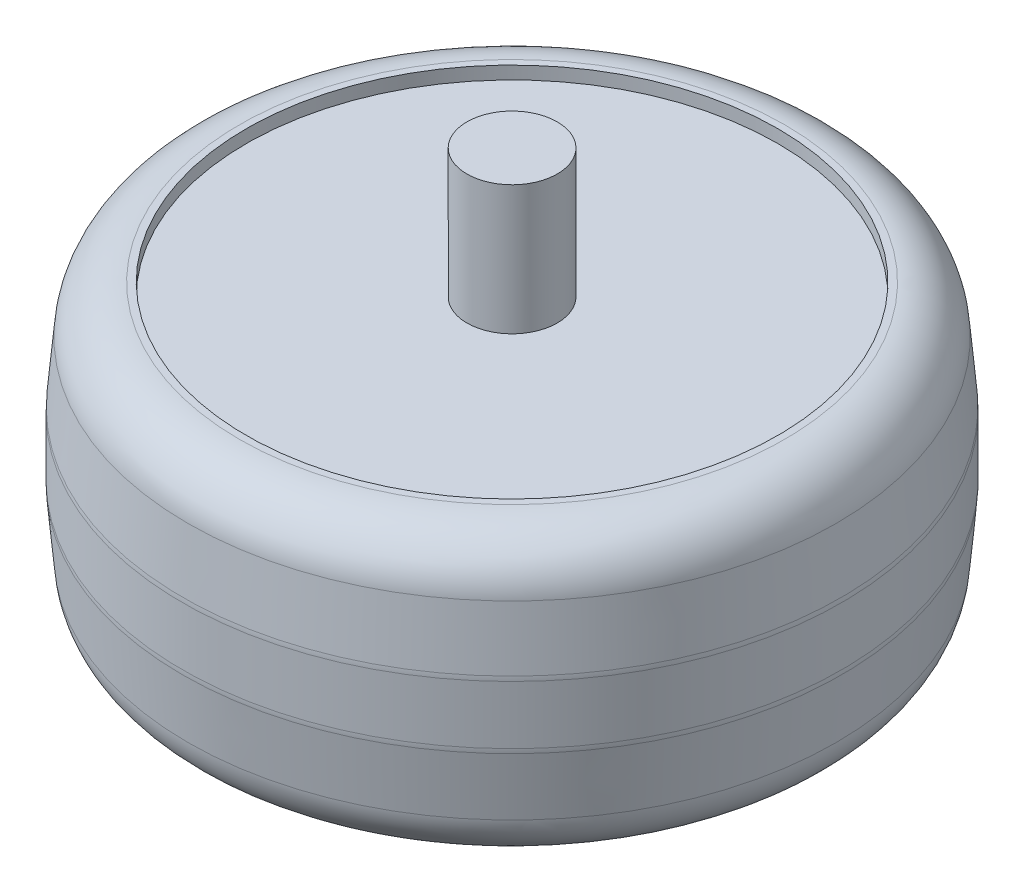
ISO-10303-21;
HEADER;
FILE_DESCRIPTION(('STEP AP214'),'2;1');
FILE_NAME('part.step','',(''),(''),'','','');
FILE_SCHEMA(('AUTOMOTIVE_DESIGN { 1 0 10303 214 1 1 1 1 }'));
ENDSEC;
DATA;
#1=APPLICATION_CONTEXT('core data for automotive mechanical design processes');
#2=APPLICATION_PROTOCOL_DEFINITION('international standard','automotive_design',2000,#1);
#3=PRODUCT_CONTEXT('',#1,'mechanical');
#4=PRODUCT('Part','Part','',(#3));
#5=PRODUCT_RELATED_PRODUCT_CATEGORY('part','',(#4));
#6=PRODUCT_DEFINITION_FORMATION('','',#4);
#7=PRODUCT_DEFINITION_CONTEXT('part definition',#1,'design');
#8=PRODUCT_DEFINITION('design','',#6,#7);
#9=PRODUCT_DEFINITION_SHAPE('','',#8);
#10=(LENGTH_UNIT() NAMED_UNIT(*) SI_UNIT(.MILLI.,.METRE.));
#11=(NAMED_UNIT(*) PLANE_ANGLE_UNIT() SI_UNIT($,.RADIAN.));
#12=(NAMED_UNIT(*) SI_UNIT($,.STERADIAN.) SOLID_ANGLE_UNIT());
#13=UNCERTAINTY_MEASURE_WITH_UNIT(LENGTH_MEASURE(1.E-05),#10,'distance_accuracy_value','');
#14=(GEOMETRIC_REPRESENTATION_CONTEXT(3) GLOBAL_UNCERTAINTY_ASSIGNED_CONTEXT((#13)) GLOBAL_UNIT_ASSIGNED_CONTEXT((#10,
#11,#12)) REPRESENTATION_CONTEXT('',''));
#15=CARTESIAN_POINT('',(0.,0.,0.));
#16=DIRECTION('',(0.,0.,1.));
#17=DIRECTION('',(1.,0.,0.));
#18=AXIS2_PLACEMENT_3D('',#15,#16,#17);
#19=CARTESIAN_POINT('',(0.,20.,0.));
#20=DIRECTION('',(0.,1.,0.));
#21=DIRECTION('',(0.,0.,1.));
#22=AXIS2_PLACEMENT_3D('',#19,#20,#21);
#23=PLANE('',#22);
#24=CARTESIAN_POINT('',(0.,20.,0.));
#25=DIRECTION('',(0.,1.,0.));
#26=DIRECTION('',(0.,0.,1.));
#27=AXIS2_PLACEMENT_3D('',#24,#25,#26);
#28=CIRCLE('',#27,3.5);
#29=CARTESIAN_POINT('',(0.,20.,3.5));
#30=VERTEX_POINT('',#29);
#31=EDGE_CURVE('E71',#30,#30,#28,.T.);
#32=ORIENTED_EDGE('',*,*,#31,.F.);
#33=EDGE_LOOP('',(#32));
#34=FACE_BOUND('',#33,.T.);
#35=CARTESIAN_POINT('',(0.,20.,0.));
#36=DIRECTION('',(0.,1.,0.));
#37=DIRECTION('',(0.,0.,1.));
#38=AXIS2_PLACEMENT_3D('',#35,#36,#37);
#39=CIRCLE('',#38,20.5902665474583);
#40=CARTESIAN_POINT('',(0.,20.,-20.5902665474583));
#41=VERTEX_POINT('',#40);
#42=EDGE_CURVE('E62',#41,#41,#39,.F.);
#43=ORIENTED_EDGE('',*,*,#42,.F.);
#44=EDGE_LOOP('',(#43));
#45=FACE_BOUND('',#44,.T.);
#46=ADVANCED_FACE('F30',(#34,#45),#23,.T.);
#47=CARTESIAN_POINT('',(0.,30.,0.));
#48=DIRECTION('',(0.,-1.,0.));
#49=DIRECTION('',(0.,0.,-1.));
#50=AXIS2_PLACEMENT_3D('',#47,#48,#49);
#51=CYLINDRICAL_SURFACE('',#50,3.5);
#52=ORIENTED_EDGE('',*,*,#31,.T.);
#53=EDGE_LOOP('',(#52));
#54=FACE_BOUND('',#53,.T.);
#55=CARTESIAN_POINT('',(0.,30.,0.));
#56=DIRECTION('',(0.,-1.,0.));
#57=DIRECTION('',(0.,0.,-1.));
#58=AXIS2_PLACEMENT_3D('',#55,#56,#57);
#59=CIRCLE('',#58,3.5);
#60=CARTESIAN_POINT('',(0.,30.,-3.5));
#61=VERTEX_POINT('',#60);
#62=EDGE_CURVE('E72',#61,#61,#59,.T.);
#63=ORIENTED_EDGE('',*,*,#62,.T.);
#64=EDGE_LOOP('',(#63));
#65=FACE_BOUND('',#64,.T.);
#66=ADVANCED_FACE('F113',(#54,#65),#51,.T.);
#67=CARTESIAN_POINT('',(0.,30.,0.));
#68=DIRECTION('',(0.,-1.,0.));
#69=DIRECTION('',(0.,0.,-1.));
#70=AXIS2_PLACEMENT_3D('',#67,#68,#69);
#71=PLANE('',#70);
#72=ORIENTED_EDGE('',*,*,#62,.F.);
#73=EDGE_LOOP('',(#72));
#74=FACE_BOUND('',#73,.T.);
#75=ADVANCED_FACE('F93',(#74),#71,.F.);
#76=CARTESIAN_POINT('',(0.,21.,0.));
#77=DIRECTION('',(0.,-1.,0.));
#78=DIRECTION('',(0.,0.,-1.));
#79=AXIS2_PLACEMENT_3D('',#76,#77,#78);
#80=CYLINDRICAL_SURFACE('',#79,20.5902665474583);
#81=CARTESIAN_POINT('',(0.,-1.,0.));
#82=DIRECTION('',(0.,1.,0.));
#83=DIRECTION('',(0.,0.,1.));
#84=AXIS2_PLACEMENT_3D('',#81,#82,#83);
#85=CIRCLE('',#84,20.5902665474583);
#86=CARTESIAN_POINT('',(0.,-1.,-20.5902665474583));
#87=VERTEX_POINT('',#86);
#88=EDGE_CURVE('E83',#87,#87,#85,.T.);
#89=CARTESIAN_POINT('',(0.,0.,0.));
#90=DIRECTION('',(0.,1.,0.));
#91=DIRECTION('',(0.,0.,1.));
#92=AXIS2_PLACEMENT_3D('',#89,#90,#91);
#93=CIRCLE('',#92,20.5902665474583);
#94=CARTESIAN_POINT('',(0.,0.,-20.5902665474583));
#95=VERTEX_POINT('',#94);
#96=EDGE_CURVE('E63',#95,#95,#93,.F.);
#97=CARTESIAN_POINT('',(0.,-1.,-20.5902665474583));
#98=CARTESIAN_POINT('',(0.,-0.989583333333334,-20.5902665474583));
#99=CARTESIAN_POINT('',(0.,-0.979166666666668,-20.5902665474583));
#100=CARTESIAN_POINT('',(0.,-0.958333333333334,-20.5902665474583));
#101=CARTESIAN_POINT('',(0.,-0.947916666666668,-20.5902665474583));
#102=CARTESIAN_POINT('',(0.,-0.927083333333334,-20.5902665474583));
#103=CARTESIAN_POINT('',(0.,-0.916666666666668,-20.5902665474583));
#104=CARTESIAN_POINT('',(0.,-0.895833333333334,-20.5902665474583));
#105=CARTESIAN_POINT('',(0.,-0.885416666666668,-20.5902665474583));
#106=CARTESIAN_POINT('',(0.,-0.864583333333334,-20.5902665474583));
#107=CARTESIAN_POINT('',(0.,-0.854166666666667,-20.5902665474583));
#108=CARTESIAN_POINT('',(0.,-0.833333333333334,-20.5902665474583));
#109=CARTESIAN_POINT('',(0.,-0.822916666666667,-20.5902665474583));
#110=CARTESIAN_POINT('',(0.,-0.802083333333334,-20.5902665474583));
#111=CARTESIAN_POINT('',(0.,-0.791666666666667,-20.5902665474583));
#112=CARTESIAN_POINT('',(0.,-0.770833333333334,-20.5902665474583));
#113=CARTESIAN_POINT('',(0.,-0.760416666666667,-20.5902665474583));
#114=CARTESIAN_POINT('',(0.,-0.739583333333334,-20.5902665474583));
#115=CARTESIAN_POINT('',(0.,-0.729166666666667,-20.5902665474583));
#116=CARTESIAN_POINT('',(0.,-0.708333333333334,-20.5902665474583));
#117=CARTESIAN_POINT('',(0.,-0.697916666666667,-20.5902665474583));
#118=CARTESIAN_POINT('',(0.,-0.677083333333334,-20.5902665474583));
#119=CARTESIAN_POINT('',(0.,-0.666666666666667,-20.5902665474583));
#120=CARTESIAN_POINT('',(0.,-0.645833333333334,-20.5902665474583));
#121=CARTESIAN_POINT('',(0.,-0.635416666666667,-20.5902665474583));
#122=CARTESIAN_POINT('',(0.,-0.614583333333334,-20.5902665474583));
#123=CARTESIAN_POINT('',(0.,-0.604166666666667,-20.5902665474583));
#124=CARTESIAN_POINT('',(0.,-0.583333333333334,-20.5902665474583));
#125=CARTESIAN_POINT('',(0.,-0.572916666666667,-20.5902665474583));
#126=CARTESIAN_POINT('',(0.,-0.552083333333334,-20.5902665474583));
#127=CARTESIAN_POINT('',(0.,-0.541666666666667,-20.5902665474583));
#128=CARTESIAN_POINT('',(0.,-0.520833333333334,-20.5902665474583));
#129=CARTESIAN_POINT('',(0.,-0.510416666666667,-20.5902665474583));
#130=CARTESIAN_POINT('',(0.,-0.489583333333334,-20.5902665474583));
#131=CARTESIAN_POINT('',(0.,-0.479166666666667,-20.5902665474583));
#132=CARTESIAN_POINT('',(0.,-0.458333333333334,-20.5902665474583));
#133=CARTESIAN_POINT('',(0.,-0.447916666666667,-20.5902665474583));
#134=CARTESIAN_POINT('',(0.,-0.427083333333334,-20.5902665474583));
#135=CARTESIAN_POINT('',(0.,-0.416666666666667,-20.5902665474583));
#136=CARTESIAN_POINT('',(0.,-0.395833333333334,-20.5902665474583));
#137=CARTESIAN_POINT('',(0.,-0.385416666666667,-20.5902665474583));
#138=CARTESIAN_POINT('',(0.,-0.364583333333334,-20.5902665474583));
#139=CARTESIAN_POINT('',(0.,-0.354166666666667,-20.5902665474583));
#140=CARTESIAN_POINT('',(0.,-0.333333333333334,-20.5902665474583));
#141=CARTESIAN_POINT('',(0.,-0.322916666666667,-20.5902665474583));
#142=CARTESIAN_POINT('',(0.,-0.302083333333334,-20.5902665474583));
#143=CARTESIAN_POINT('',(0.,-0.291666666666667,-20.5902665474583));
#144=CARTESIAN_POINT('',(0.,-0.270833333333334,-20.5902665474583));
#145=CARTESIAN_POINT('',(0.,-0.260416666666667,-20.5902665474583));
#146=CARTESIAN_POINT('',(0.,-0.239583333333334,-20.5902665474583));
#147=CARTESIAN_POINT('',(0.,-0.229166666666667,-20.5902665474583));
#148=CARTESIAN_POINT('',(0.,-0.208333333333334,-20.5902665474583));
#149=CARTESIAN_POINT('',(0.,-0.197916666666667,-20.5902665474583));
#150=CARTESIAN_POINT('',(0.,-0.177083333333333,-20.5902665474583));
#151=CARTESIAN_POINT('',(0.,-0.166666666666667,-20.5902665474583));
#152=CARTESIAN_POINT('',(0.,-0.145833333333333,-20.5902665474583));
#153=CARTESIAN_POINT('',(0.,-0.135416666666667,-20.5902665474583));
#154=CARTESIAN_POINT('',(0.,-0.114583333333333,-20.5902665474583));
#155=CARTESIAN_POINT('',(0.,-0.104166666666667,-20.5902665474583));
#156=CARTESIAN_POINT('',(0.,-0.0833333333333334,-20.5902665474583));
#157=CARTESIAN_POINT('',(0.,-0.0729166666666667,-20.5902665474583));
#158=CARTESIAN_POINT('',(0.,-0.0520833333333334,-20.5902665474583));
#159=CARTESIAN_POINT('',(0.,-0.0416666666666667,-20.5902665474583));
#160=CARTESIAN_POINT('',(0.,-0.0208333333333333,-20.5902665474583));
#161=CARTESIAN_POINT('',(0.,-0.0104166666666667,-20.5902665474583));
#162=CARTESIAN_POINT('',(0.,0.,-20.5902665474583));
#163=B_SPLINE_CURVE_WITH_KNOTS('',3,(#97,#98,#99,#100,#101,#102,#103,#104,#105,#106,#107,#108,
#109,#110,#111,#112,#113,#114,#115,#116,#117,#118,#119,#120,#121,#122,#123,#124,#125,#126,#127,
#128,#129,#130,#131,#132,#133,#134,#135,#136,#137,#138,#139,#140,#141,#142,#143,#144,#145,#146,
#147,#148,#149,#150,#151,#152,#153,#154,#155,#156,#157,#158,#159,#160,#161,#162),.UNSPECIFIED.,
.F.,.F.,(4,2,2,2,2,2,2,2,2,2,2,2,2,2,2,2,2,2,2,2,2,2,2,2,2,2,2,2,2,2,2,2,4),(0.,0.03125,
0.0625000000000001,0.0937500000000001,0.125,0.15625,0.1875,0.21875,0.25,0.28125,0.3125,0.34375,
0.375,0.40625,0.4375,0.46875,0.5,0.53125,0.5625,0.593750000000001,0.625000000000001,
0.656250000000001,0.687500000000001,0.718750000000001,0.750000000000001,0.781250000000001,
0.812500000000001,0.843750000000001,0.875000000000001,0.906250000000001,0.937500000000001,
0.968750000000001,1.),.UNSPECIFIED.);
#164=EDGE_CURVE('BSEAM89',#87,#95,#163,.T.);
#165=ORIENTED_EDGE('',*,*,#88,.F.);
#166=ORIENTED_EDGE('',*,*,#96,.F.);
#167=ORIENTED_EDGE('',*,*,#164,.T.);
#168=ORIENTED_EDGE('',*,*,#164,.F.);
#169=EDGE_LOOP('',(#165,#167,#166,#168));
#170=FACE_BOUND('',#169,.T.);
#171=ADVANCED_FACE('F89',(#170),#80,.F.);
#172=CARTESIAN_POINT('',(0.,21.,0.));
#173=DIRECTION('',(0.,1.,0.));
#174=DIRECTION('',(0.,0.,1.));
#175=AXIS2_PLACEMENT_3D('',#172,#173,#174);
#176=PLANE('',#175);
#177=CARTESIAN_POINT('',(0.,21.,0.));
#178=DIRECTION('',(0.,1.,0.));
#179=DIRECTION('',(0.,0.,1.));
#180=AXIS2_PLACEMENT_3D('',#177,#178,#179);
#181=CIRCLE('',#180,21.1186546699034);
#182=CARTESIAN_POINT('',(0.,21.,21.1186546699034));
#183=VERTEX_POINT('',#182);
#184=EDGE_CURVE('E59',#183,#183,#181,.T.);
#185=ORIENTED_EDGE('',*,*,#184,.T.);
#186=EDGE_LOOP('',(#185));
#187=FACE_BOUND('',#186,.T.);
#188=CARTESIAN_POINT('',(0.,21.,0.));
#189=DIRECTION('',(0.,1.,0.));
#190=DIRECTION('',(0.,0.,1.));
#191=AXIS2_PLACEMENT_3D('',#188,#189,#190);
#192=CIRCLE('',#191,20.5902665474583);
#193=CARTESIAN_POINT('',(0.,21.,-20.5902665474583));
#194=VERTEX_POINT('',#193);
#195=EDGE_CURVE('E67',#194,#194,#192,.T.);
#196=ORIENTED_EDGE('',*,*,#195,.F.);
#197=EDGE_LOOP('',(#196));
#198=FACE_BOUND('',#197,.T.);
#199=ADVANCED_FACE('F92',(#187,#198),#176,.T.);
#200=CARTESIAN_POINT('',(0.,21.,0.));
#201=DIRECTION('',(0.,-1.,0.));
#202=DIRECTION('',(0.,0.,-1.));
#203=AXIS2_PLACEMENT_3D('',#200,#201,#202);
#204=CYLINDRICAL_SURFACE('',#203,25.5339793659734);
#205=CARTESIAN_POINT('',(0.,12.2528170012917,0.));
#206=DIRECTION('',(0.,1.,0.));
#207=DIRECTION('',(0.,0.,1.));
#208=AXIS2_PLACEMENT_3D('',#205,#206,#207);
#209=CIRCLE('',#208,25.5339793659734);
#210=CARTESIAN_POINT('',(0.,12.2528170012917,-25.5339793659734));
#211=VERTEX_POINT('',#210);
#212=EDGE_CURVE('E45',#211,#211,#209,.F.);
#213=CARTESIAN_POINT('',(0.,7.74718299870873,0.));
#214=DIRECTION('',(0.,-1.,0.));
#215=DIRECTION('',(0.,0.,-1.));
#216=AXIS2_PLACEMENT_3D('',#213,#214,#215);
#217=CIRCLE('',#216,25.5339793659734);
#218=CARTESIAN_POINT('',(0.,7.74718299870873,-25.5339793659734));
#219=VERTEX_POINT('',#218);
#220=EDGE_CURVE('E50',#219,#219,#217,.F.);
#221=CARTESIAN_POINT('',(0.,12.2528170012917,-25.5339793659734));
#222=CARTESIAN_POINT('',(0.,12.2058833137648,-25.5339793659734));
#223=CARTESIAN_POINT('',(0.,12.1589496262379,-25.5339793659734));
#224=CARTESIAN_POINT('',(0.,12.065082251184,-25.5339793659734));
#225=CARTESIAN_POINT('',(0.,12.0181485636571,-25.5339793659734));
#226=CARTESIAN_POINT('',(0.,11.9242811886033,-25.5339793659734));
#227=CARTESIAN_POINT('',(0.,11.8773475010764,-25.5339793659734));
#228=CARTESIAN_POINT('',(0.,11.7834801260226,-25.5339793659734));
#229=CARTESIAN_POINT('',(0.,11.7365464384957,-25.5339793659734));
#230=CARTESIAN_POINT('',(0.,11.6426790634419,-25.5339793659734));
#231=CARTESIAN_POINT('',(0.,11.595745375915,-25.5339793659734));
#232=CARTESIAN_POINT('',(0.,11.5018780008612,-25.5339793659734));
#233=CARTESIAN_POINT('',(0.,11.4549443133343,-25.5339793659734));
#234=CARTESIAN_POINT('',(0.,11.3610769382805,-25.5339793659734));
#235=CARTESIAN_POINT('',(0.,11.3141432507536,-25.5339793659734));
#236=CARTESIAN_POINT('',(0.,11.2202758756997,-25.5339793659734));
#237=CARTESIAN_POINT('',(0.,11.1733421881728,-25.5339793659734));
#238=CARTESIAN_POINT('',(0.,11.079474813119,-25.5339793659734));
#239=CARTESIAN_POINT('',(0.,11.0325411255921,-25.5339793659734));
#240=CARTESIAN_POINT('',(0.,10.9386737505383,-25.5339793659734));
#241=CARTESIAN_POINT('',(0.,10.8917400630114,-25.5339793659734));
#242=CARTESIAN_POINT('',(0.,10.7978726879576,-25.5339793659734));
#243=CARTESIAN_POINT('',(0.,10.7509390004307,-25.5339793659734));
#244=CARTESIAN_POINT('',(0.,10.6570716253769,-25.5339793659734));
#245=CARTESIAN_POINT('',(0.,10.61013793785,-25.5339793659734));
#246=CARTESIAN_POINT('',(0.,10.5162705627962,-25.5339793659734));
#247=CARTESIAN_POINT('',(0.,10.4693368752693,-25.5339793659734));
#248=CARTESIAN_POINT('',(0.,10.3754695002154,-25.5339793659734));
#249=CARTESIAN_POINT('',(0.,10.3285358126885,-25.5339793659734));
#250=CARTESIAN_POINT('',(0.,10.2346684376347,-25.5339793659734));
#251=CARTESIAN_POINT('',(0.,10.1877347501078,-25.5339793659734));
#252=CARTESIAN_POINT('',(0.,10.093867375054,-25.5339793659734));
#253=CARTESIAN_POINT('',(0.,10.0469336875271,-25.5339793659734));
#254=CARTESIAN_POINT('',(0.,9.95306631247329,-25.5339793659734));
#255=CARTESIAN_POINT('',(0.,9.90613262494639,-25.5339793659734));
#256=CARTESIAN_POINT('',(0.,9.81226524989257,-25.5339793659734));
#257=CARTESIAN_POINT('',(0.,9.76533156236567,-25.5339793659734));
#258=CARTESIAN_POINT('',(0.,9.67146418731186,-25.5339793659734));
#259=CARTESIAN_POINT('',(0.,9.62453049978495,-25.5339793659734));
#260=CARTESIAN_POINT('',(0.,9.53066312473114,-25.5339793659734));
#261=CARTESIAN_POINT('',(0.,9.48372943720424,-25.5339793659734));
#262=CARTESIAN_POINT('',(0.,9.38986206215042,-25.5339793659734));
#263=CARTESIAN_POINT('',(0.,9.34292837462352,-25.5339793659734));
#264=CARTESIAN_POINT('',(0.,9.24906099956971,-25.5339793659734));
#265=CARTESIAN_POINT('',(0.,9.2021273120428,-25.5339793659734));
#266=CARTESIAN_POINT('',(0.,9.10825993698899,-25.5339793659734));
#267=CARTESIAN_POINT('',(0.,9.06132624946209,-25.5339793659734));
#268=CARTESIAN_POINT('',(0.,8.96745887440827,-25.5339793659734));
#269=CARTESIAN_POINT('',(0.,8.92052518688137,-25.5339793659734));
#270=CARTESIAN_POINT('',(0.,8.82665781182756,-25.5339793659734));
#271=CARTESIAN_POINT('',(0.,8.77972412430065,-25.5339793659734));
#272=CARTESIAN_POINT('',(0.,8.68585674924684,-25.5339793659734));
#273=CARTESIAN_POINT('',(0.,8.63892306171994,-25.5339793659734));
#274=CARTESIAN_POINT('',(0.,8.54505568666612,-25.5339793659734));
#275=CARTESIAN_POINT('',(0.,8.49812199913922,-25.5339793659734));
#276=CARTESIAN_POINT('',(0.,8.40425462408541,-25.5339793659734));
#277=CARTESIAN_POINT('',(0.,8.3573209365585,-25.5339793659734));
#278=CARTESIAN_POINT('',(0.,8.26345356150469,-25.5339793659734));
#279=CARTESIAN_POINT('',(0.,8.21651987397779,-25.5339793659734));
#280=CARTESIAN_POINT('',(0.,8.12265249892397,-25.5339793659734));
#281=CARTESIAN_POINT('',(0.,8.07571881139707,-25.5339793659734));
#282=CARTESIAN_POINT('',(0.,7.98185143634326,-25.5339793659734));
#283=CARTESIAN_POINT('',(0.,7.93491774881635,-25.5339793659734));
#284=CARTESIAN_POINT('',(0.,7.84105037376254,-25.5339793659734));
#285=CARTESIAN_POINT('',(0.,7.79411668623564,-25.5339793659734));
#286=CARTESIAN_POINT('',(0.,7.74718299870873,-25.5339793659734));
#287=B_SPLINE_CURVE_WITH_KNOTS('',3,(#221,#222,#223,#224,#225,#226,#227,#228,#229,#230,#231,
#232,#233,#234,#235,#236,#237,#238,#239,#240,#241,#242,#243,#244,#245,#246,#247,#248,#249,#250,
#251,#252,#253,#254,#255,#256,#257,#258,#259,#260,#261,#262,#263,#264,#265,#266,#267,#268,#269,
#270,#271,#272,#273,#274,#275,#276,#277,#278,#279,#280,#281,#282,#283,#284,#285,#286),
.UNSPECIFIED.,.F.,.F.,(4,2,2,2,2,2,2,2,2,2,2,2,2,2,2,2,2,2,2,2,2,2,2,2,2,2,2,2,2,2,2,2,4),(0.,
0.140801062580716,0.281602125161434,0.42240318774215,0.563204250322868,0.704005312903584,
0.8448063754843,0.985607438065018,1.12640850064573,1.26720956322645,1.40801062580717,
1.54881168838788,1.6896127509686,1.83041381354932,1.97121487613003,2.11201593871075,
2.25281700129147,2.39361806387219,2.5344191264529,2.67522018903362,2.81602125161434,
2.95682231419505,3.09762337677577,3.23842443935649,3.3792255019372,3.52002656451792,
3.66082762709864,3.80162868967935,3.94242975226007,4.08323081484079,4.2240318774215,
4.36483294000222,4.50563400258294),.UNSPECIFIED.);
#288=EDGE_CURVE('BSEAM130',#211,#219,#287,.T.);
#289=ORIENTED_EDGE('',*,*,#212,.T.);
#290=ORIENTED_EDGE('',*,*,#220,.T.);
#291=ORIENTED_EDGE('',*,*,#288,.T.);
#292=ORIENTED_EDGE('',*,*,#288,.F.);
#293=EDGE_LOOP('',(#289,#291,#290,#292));
#294=FACE_BOUND('',#293,.T.);
#295=ADVANCED_FACE('F130',(#294),#204,.T.);
#296=CARTESIAN_POINT('',(0.,20.,-20.5902665474583));
#297=CARTESIAN_POINT('',(0.,20.0104166666667,-20.5902665474583));
#298=CARTESIAN_POINT('',(0.,20.0208333333333,-20.5902665474583));
#299=CARTESIAN_POINT('',(0.,20.0416666666667,-20.5902665474583));
#300=CARTESIAN_POINT('',(0.,20.0520833333333,-20.5902665474583));
#301=CARTESIAN_POINT('',(0.,20.0729166666667,-20.5902665474583));
#302=CARTESIAN_POINT('',(0.,20.0833333333333,-20.5902665474583));
#303=CARTESIAN_POINT('',(0.,20.1041666666667,-20.5902665474583));
#304=CARTESIAN_POINT('',(0.,20.1145833333333,-20.5902665474583));
#305=CARTESIAN_POINT('',(0.,20.1354166666667,-20.5902665474583));
#306=CARTESIAN_POINT('',(0.,20.1458333333333,-20.5902665474583));
#307=CARTESIAN_POINT('',(0.,20.1666666666667,-20.5902665474583));
#308=CARTESIAN_POINT('',(0.,20.1770833333333,-20.5902665474583));
#309=CARTESIAN_POINT('',(0.,20.1979166666667,-20.5902665474583));
#310=CARTESIAN_POINT('',(0.,20.2083333333333,-20.5902665474583));
#311=CARTESIAN_POINT('',(0.,20.2291666666667,-20.5902665474583));
#312=CARTESIAN_POINT('',(0.,20.2395833333333,-20.5902665474583));
#313=CARTESIAN_POINT('',(0.,20.2604166666667,-20.5902665474583));
#314=CARTESIAN_POINT('',(0.,20.2708333333333,-20.5902665474583));
#315=CARTESIAN_POINT('',(0.,20.2916666666667,-20.5902665474583));
#316=CARTESIAN_POINT('',(0.,20.3020833333333,-20.5902665474583));
#317=CARTESIAN_POINT('',(0.,20.3229166666667,-20.5902665474583));
#318=CARTESIAN_POINT('',(0.,20.3333333333333,-20.5902665474583));
#319=CARTESIAN_POINT('',(0.,20.3541666666667,-20.5902665474583));
#320=CARTESIAN_POINT('',(0.,20.3645833333333,-20.5902665474583));
#321=CARTESIAN_POINT('',(0.,20.3854166666667,-20.5902665474583));
#322=CARTESIAN_POINT('',(0.,20.3958333333333,-20.5902665474583));
#323=CARTESIAN_POINT('',(0.,20.4166666666667,-20.5902665474583));
#324=CARTESIAN_POINT('',(0.,20.4270833333333,-20.5902665474583));
#325=CARTESIAN_POINT('',(0.,20.4479166666667,-20.5902665474583));
#326=CARTESIAN_POINT('',(0.,20.4583333333333,-20.5902665474583));
#327=CARTESIAN_POINT('',(0.,20.4791666666667,-20.5902665474583));
#328=CARTESIAN_POINT('',(0.,20.4895833333333,-20.5902665474583));
#329=CARTESIAN_POINT('',(0.,20.5104166666667,-20.5902665474583));
#330=CARTESIAN_POINT('',(0.,20.5208333333333,-20.5902665474583));
#331=CARTESIAN_POINT('',(0.,20.5416666666667,-20.5902665474583));
#332=CARTESIAN_POINT('',(0.,20.5520833333333,-20.5902665474583));
#333=CARTESIAN_POINT('',(0.,20.5729166666667,-20.5902665474583));
#334=CARTESIAN_POINT('',(0.,20.5833333333333,-20.5902665474583));
#335=CARTESIAN_POINT('',(0.,20.6041666666667,-20.5902665474583));
#336=CARTESIAN_POINT('',(0.,20.6145833333333,-20.5902665474583));
#337=CARTESIAN_POINT('',(0.,20.6354166666667,-20.5902665474583));
#338=CARTESIAN_POINT('',(0.,20.6458333333333,-20.5902665474583));
#339=CARTESIAN_POINT('',(0.,20.6666666666667,-20.5902665474583));
#340=CARTESIAN_POINT('',(0.,20.6770833333333,-20.5902665474583));
#341=CARTESIAN_POINT('',(0.,20.6979166666667,-20.5902665474583));
#342=CARTESIAN_POINT('',(0.,20.7083333333333,-20.5902665474583));
#343=CARTESIAN_POINT('',(0.,20.7291666666667,-20.5902665474583));
#344=CARTESIAN_POINT('',(0.,20.7395833333333,-20.5902665474583));
#345=CARTESIAN_POINT('',(0.,20.7604166666667,-20.5902665474583));
#346=CARTESIAN_POINT('',(0.,20.7708333333333,-20.5902665474583));
#347=CARTESIAN_POINT('',(0.,20.7916666666667,-20.5902665474583));
#348=CARTESIAN_POINT('',(0.,20.8020833333333,-20.5902665474583));
#349=CARTESIAN_POINT('',(0.,20.8229166666667,-20.5902665474583));
#350=CARTESIAN_POINT('',(0.,20.8333333333333,-20.5902665474583));
#351=CARTESIAN_POINT('',(0.,20.8541666666667,-20.5902665474583));
#352=CARTESIAN_POINT('',(0.,20.8645833333333,-20.5902665474583));
#353=CARTESIAN_POINT('',(0.,20.8854166666667,-20.5902665474583));
#354=CARTESIAN_POINT('',(0.,20.8958333333333,-20.5902665474583));
#355=CARTESIAN_POINT('',(0.,20.9166666666667,-20.5902665474583));
#356=CARTESIAN_POINT('',(0.,20.9270833333333,-20.5902665474583));
#357=CARTESIAN_POINT('',(0.,20.9479166666667,-20.5902665474583));
#358=CARTESIAN_POINT('',(0.,20.9583333333333,-20.5902665474583));
#359=CARTESIAN_POINT('',(0.,20.9791666666667,-20.5902665474583));
#360=CARTESIAN_POINT('',(0.,20.9895833333333,-20.5902665474583));
#361=CARTESIAN_POINT('',(0.,21.,-20.5902665474583));
#362=B_SPLINE_CURVE_WITH_KNOTS('',3,(#296,#297,#298,#299,#300,#301,#302,#303,#304,#305,#306,
#307,#308,#309,#310,#311,#312,#313,#314,#315,#316,#317,#318,#319,#320,#321,#322,#323,#324,#325,
#326,#327,#328,#329,#330,#331,#332,#333,#334,#335,#336,#337,#338,#339,#340,#341,#342,#343,#344,
#345,#346,#347,#348,#349,#350,#351,#352,#353,#354,#355,#356,#357,#358,#359,#360,#361),
.UNSPECIFIED.,.F.,.F.,(4,2,2,2,2,2,2,2,2,2,2,2,2,2,2,2,2,2,2,2,2,2,2,2,2,2,2,2,2,2,2,2,4),(0.,
0.03125,0.0625000000000001,0.0937500000000001,0.125,0.15625,0.1875,0.21875,0.25,0.28125,0.3125,
0.34375,0.375,0.40625,0.4375,0.46875,0.5,0.53125,0.5625,0.593750000000001,0.625000000000001,
0.656250000000001,0.687500000000001,0.718750000000001,0.750000000000001,0.781250000000001,
0.812500000000001,0.843750000000001,0.875000000000001,0.906250000000001,0.937500000000001,
0.968750000000001,1.),.UNSPECIFIED.);
#363=EDGE_CURVE('BSEAM95',#41,#194,#362,.T.);
#364=ORIENTED_EDGE('',*,*,#42,.T.);
#365=ORIENTED_EDGE('',*,*,#195,.T.);
#366=ORIENTED_EDGE('',*,*,#363,.T.);
#367=ORIENTED_EDGE('',*,*,#363,.F.);
#368=EDGE_LOOP('',(#364,#366,#365,#367));
#369=FACE_BOUND('',#368,.T.);
#370=ADVANCED_FACE('F95',(#369),#80,.F.);
#371=CARTESIAN_POINT('',(0.,-1.,0.));
#372=DIRECTION('',(0.,1.,0.));
#373=DIRECTION('',(0.,0.,1.));
#374=AXIS2_PLACEMENT_3D('',#371,#372,#373);
#375=PLANE('',#374);
#376=CARTESIAN_POINT('',(0.,-1.,0.));
#377=DIRECTION('',(0.,1.,0.));
#378=DIRECTION('',(0.,0.,1.));
#379=AXIS2_PLACEMENT_3D('',#376,#377,#378);
#380=CIRCLE('',#379,21.1186546699034);
#381=CARTESIAN_POINT('',(0.,-1.,21.1186546699034));
#382=VERTEX_POINT('',#381);
#383=EDGE_CURVE('E10',#382,#382,#380,.F.);
#384=ORIENTED_EDGE('',*,*,#383,.T.);
#385=EDGE_LOOP('',(#384));
#386=FACE_BOUND('',#385,.T.);
#387=ORIENTED_EDGE('',*,*,#88,.T.);
#388=EDGE_LOOP('',(#387));
#389=FACE_BOUND('',#388,.T.);
#390=ADVANCED_FACE('F87',(#386,#389),#375,.F.);
#391=CARTESIAN_POINT('',(0.,-10.,0.));
#392=DIRECTION('',(0.,-1.,0.));
#393=DIRECTION('',(0.,0.,-1.));
#394=AXIS2_PLACEMENT_3D('',#391,#392,#393);
#395=PLANE('',#394);
#396=CARTESIAN_POINT('',(0.,-10.,0.));
#397=DIRECTION('',(0.,-1.,0.));
#398=DIRECTION('',(0.,0.,-1.));
#399=AXIS2_PLACEMENT_3D('',#396,#397,#398);
#400=CIRCLE('',#399,3.5);
#401=CARTESIAN_POINT('',(0.,-10.,-3.5));
#402=VERTEX_POINT('',#401);
#403=EDGE_CURVE('E66',#402,#402,#400,.T.);
#404=ORIENTED_EDGE('',*,*,#403,.T.);
#405=EDGE_LOOP('',(#404));
#406=FACE_BOUND('',#405,.T.);
#407=ADVANCED_FACE('F110',(#406),#395,.T.);
#408=ORIENTED_EDGE('',*,*,#403,.F.);
#409=EDGE_LOOP('',(#408));
#410=FACE_BOUND('',#409,.T.);
#411=CARTESIAN_POINT('',(0.,0.,0.));
#412=DIRECTION('',(0.,1.,0.));
#413=DIRECTION('',(0.,0.,1.));
#414=AXIS2_PLACEMENT_3D('',#411,#412,#413);
#415=CIRCLE('',#414,3.5);
#416=CARTESIAN_POINT('',(0.,0.,3.5));
#417=VERTEX_POINT('',#416);
#418=EDGE_CURVE('E68',#417,#417,#415,.T.);
#419=ORIENTED_EDGE('',*,*,#418,.F.);
#420=EDGE_LOOP('',(#419));
#421=FACE_BOUND('',#420,.T.);
#422=ADVANCED_FACE('F101',(#410,#421),#51,.T.);
#423=CARTESIAN_POINT('',(0.,0.,0.));
#424=DIRECTION('',(0.,1.,0.));
#425=DIRECTION('',(0.,0.,1.));
#426=AXIS2_PLACEMENT_3D('',#423,#424,#425);
#427=PLANE('',#426);
#428=ORIENTED_EDGE('',*,*,#418,.T.);
#429=EDGE_LOOP('',(#428));
#430=FACE_BOUND('',#429,.T.);
#431=ORIENTED_EDGE('',*,*,#96,.T.);
#432=EDGE_LOOP('',(#431));
#433=FACE_BOUND('',#432,.T.);
#434=ADVANCED_FACE('F98',(#430,#433),#427,.F.);
#435=CARTESIAN_POINT('',(0.,7.57253922707468,0.));
#436=DIRECTION('',(0.,1.,0.));
#437=DIRECTION('',(0.,0.,1.));
#438=AXIS2_PLACEMENT_3D('',#435,#436,#437);
#439=CONICAL_SURFACE('',#438,25.5339793659734,0.0872664625997171);
#440=CARTESIAN_POINT('',(0.,7.3985600277181,0.));
#441=DIRECTION('',(0.,1.,0.));
#442=DIRECTION('',(0.,0.,1.));
#443=AXIS2_PLACEMENT_3D('',#440,#441,#442);
#444=CIRCLE('',#443,25.5187581583404);
#445=CARTESIAN_POINT('',(0.,7.3985600277181,25.5187581583404));
#446=VERTEX_POINT('',#445);
#447=EDGE_CURVE('E37',#446,#446,#444,.F.);
#448=ORIENTED_EDGE('',*,*,#447,.T.);
#449=EDGE_LOOP('',(#448));
#450=FACE_BOUND('',#449,.T.);
#451=CARTESIAN_POINT('',(0.,2.65137702900936,0.));
#452=DIRECTION('',(0.,1.,0.));
#453=DIRECTION('',(0.,0.,1.));
#454=AXIS2_PLACEMENT_3D('',#451,#452,#453);
#455=CIRCLE('',#454,25.1034334622704);
#456=CARTESIAN_POINT('',(0.,2.65137702900936,25.1034334622704));
#457=VERTEX_POINT('',#456);
#458=EDGE_CURVE('E41',#457,#457,#455,.T.);
#459=ORIENTED_EDGE('',*,*,#458,.T.);
#460=EDGE_LOOP('',(#459));
#461=FACE_BOUND('',#460,.T.);
#462=ADVANCED_FACE('F100',(#450,#461),#439,.T.);
#463=CARTESIAN_POINT('',(0.,21.,0.));
#464=DIRECTION('',(0.,-1.,0.));
#465=DIRECTION('',(0.,0.,-1.));
#466=AXIS2_PLACEMENT_3D('',#463,#464,#465);
#467=CONICAL_SURFACE('',#466,24.7839793659731,0.0872664625997183);
#468=CARTESIAN_POINT('',(0.,17.3486229709906,0.));
#469=DIRECTION('',(0.,1.,0.));
#470=DIRECTION('',(0.,0.,1.));
#471=AXIS2_PLACEMENT_3D('',#468,#469,#470);
#472=CIRCLE('',#471,25.1034334622704);
#473=CARTESIAN_POINT('',(0.,17.3486229709906,25.1034334622704));
#474=VERTEX_POINT('',#473);
#475=EDGE_CURVE('E53',#474,#474,#472,.F.);
#476=ORIENTED_EDGE('',*,*,#475,.T.);
#477=EDGE_LOOP('',(#476));
#478=FACE_BOUND('',#477,.T.);
#479=CARTESIAN_POINT('',(0.,12.6014399722823,0.));
#480=DIRECTION('',(0.,-1.,0.));
#481=DIRECTION('',(0.,0.,-1.));
#482=AXIS2_PLACEMENT_3D('',#479,#480,#481);
#483=CIRCLE('',#482,25.5187581583404);
#484=CARTESIAN_POINT('',(0.,12.6014399722823,-25.5187581583404));
#485=VERTEX_POINT('',#484);
#486=EDGE_CURVE('E56',#485,#485,#483,.F.);
#487=ORIENTED_EDGE('',*,*,#486,.T.);
#488=EDGE_LOOP('',(#487));
#489=FACE_BOUND('',#488,.T.);
#490=ADVANCED_FACE('F108',(#478,#489),#467,.T.);
#491=CARTESIAN_POINT('',(0.,17.,0.));
#492=DIRECTION('',(0.,1.,0.));
#493=DIRECTION('',(0.,0.,1.));
#494=AXIS2_PLACEMENT_3D('',#491,#492,#493);
#495=TOROIDAL_SURFACE('',#494,21.1186546699034,4.);
#496=ORIENTED_EDGE('',*,*,#475,.F.);
#497=EDGE_LOOP('',(#496));
#498=FACE_BOUND('',#497,.T.);
#499=ORIENTED_EDGE('',*,*,#184,.F.);
#500=EDGE_LOOP('',(#499));
#501=FACE_BOUND('',#500,.T.);
#502=ADVANCED_FACE('F211',(#498,#501),#495,.T.);
#503=CARTESIAN_POINT('',(0.,12.2528170012917,0.));
#504=DIRECTION('',(0.,1.,0.));
#505=DIRECTION('',(0.,0.,1.));
#506=AXIS2_PLACEMENT_3D('',#503,#504,#505);
#507=TOROIDAL_SURFACE('',#506,21.5339793659734,4.);
#508=ORIENTED_EDGE('',*,*,#486,.F.);
#509=EDGE_LOOP('',(#508));
#510=FACE_BOUND('',#509,.T.);
#511=ORIENTED_EDGE('',*,*,#212,.F.);
#512=EDGE_LOOP('',(#511));
#513=FACE_BOUND('',#512,.T.);
#514=ADVANCED_FACE('F220',(#510,#513),#507,.T.);
#515=CARTESIAN_POINT('',(0.,7.74718299870873,0.));
#516=DIRECTION('',(0.,-1.,0.));
#517=DIRECTION('',(0.,0.,-1.));
#518=AXIS2_PLACEMENT_3D('',#515,#516,#517);
#519=TOROIDAL_SURFACE('',#518,21.5339793659734,4.);
#520=ORIENTED_EDGE('',*,*,#447,.F.);
#521=EDGE_LOOP('',(#520));
#522=FACE_BOUND('',#521,.T.);
#523=ORIENTED_EDGE('',*,*,#220,.F.);
#524=EDGE_LOOP('',(#523));
#525=FACE_BOUND('',#524,.T.);
#526=ADVANCED_FACE('F229',(#522,#525),#519,.T.);
#527=CARTESIAN_POINT('',(0.,3.,0.));
#528=DIRECTION('',(0.,1.,0.));
#529=DIRECTION('',(0.,0.,1.));
#530=AXIS2_PLACEMENT_3D('',#527,#528,#529);
#531=TOROIDAL_SURFACE('',#530,21.1186546699034,4.);
#532=ORIENTED_EDGE('',*,*,#458,.F.);
#533=EDGE_LOOP('',(#532));
#534=FACE_BOUND('',#533,.T.);
#535=ORIENTED_EDGE('',*,*,#383,.F.);
#536=EDGE_LOOP('',(#535));
#537=FACE_BOUND('',#536,.T.);
#538=ADVANCED_FACE('F32',(#534,#537),#531,.T.);
#539=CLOSED_SHELL('',(#46,#66,#75,#171,#199,#295,#370,#390,#407,#422,#434,#462,#490,#502,#514,
#526,#538));
#540=MANIFOLD_SOLID_BREP('B2',#539);
#541=ADVANCED_BREP_SHAPE_REPRESENTATION('',(#18,#540),#14);
#542=SHAPE_DEFINITION_REPRESENTATION(#9,#541);
ENDSEC;
END-ISO-10303-21;
